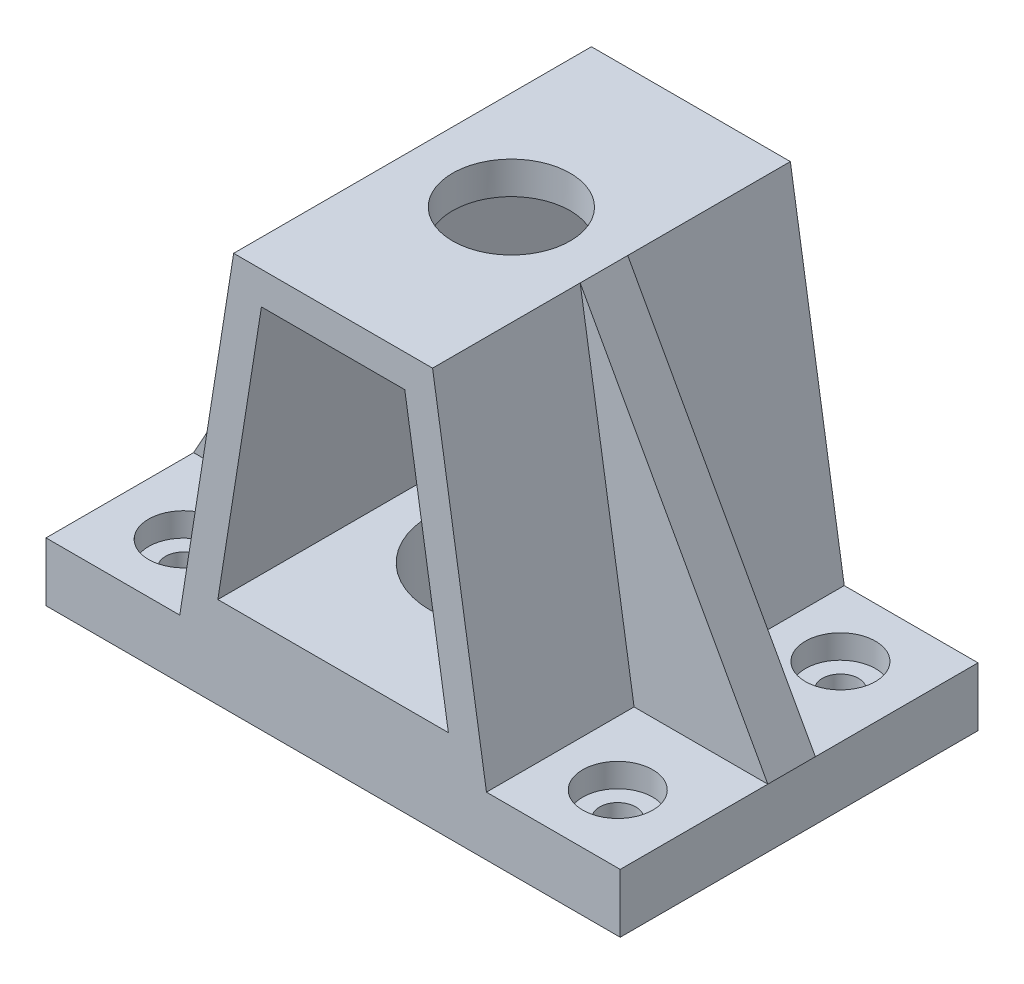
ISO-10303-21;
HEADER;
FILE_DESCRIPTION(('STEP AP214'),'2;1');
FILE_NAME('part.step','',(''),(''),'','','');
FILE_SCHEMA(('AUTOMOTIVE_DESIGN { 1 0 10303 214 1 1 1 1 }'));
ENDSEC;
DATA;
#1=APPLICATION_CONTEXT('core data for automotive mechanical design processes');
#2=APPLICATION_PROTOCOL_DEFINITION('international standard','automotive_design',2000,#1);
#3=PRODUCT_CONTEXT('',#1,'mechanical');
#4=PRODUCT('Part','Part','',(#3));
#5=PRODUCT_RELATED_PRODUCT_CATEGORY('part','',(#4));
#6=PRODUCT_DEFINITION_FORMATION('','',#4);
#7=PRODUCT_DEFINITION_CONTEXT('part definition',#1,'design');
#8=PRODUCT_DEFINITION('design','',#6,#7);
#9=PRODUCT_DEFINITION_SHAPE('','',#8);
#10=(LENGTH_UNIT() NAMED_UNIT(*) SI_UNIT(.MILLI.,.METRE.));
#11=(NAMED_UNIT(*) PLANE_ANGLE_UNIT() SI_UNIT($,.RADIAN.));
#12=(NAMED_UNIT(*) SI_UNIT($,.STERADIAN.) SOLID_ANGLE_UNIT());
#13=UNCERTAINTY_MEASURE_WITH_UNIT(LENGTH_MEASURE(1.E-05),#10,'distance_accuracy_value','');
#14=(GEOMETRIC_REPRESENTATION_CONTEXT(3) GLOBAL_UNCERTAINTY_ASSIGNED_CONTEXT((#13)) GLOBAL_UNIT_ASSIGNED_CONTEXT((#10,
#11,#12)) REPRESENTATION_CONTEXT('',''));
#15=CARTESIAN_POINT('',(0.,0.,0.));
#16=DIRECTION('',(0.,0.,1.));
#17=DIRECTION('',(1.,0.,0.));
#18=AXIS2_PLACEMENT_3D('',#15,#16,#17);
#19=CARTESIAN_POINT('',(0.,5.969,0.));
#20=DIRECTION('',(0.,-1.,0.));
#21=DIRECTION('',(0.,0.,-1.));
#22=AXIS2_PLACEMENT_3D('',#19,#20,#21);
#23=PLANE('',#22);
#24=CARTESIAN_POINT('',(-44.069,5.969,-22.6135882996382));
#25=DIRECTION('',(0.,1.,0.));
#26=DIRECTION('',(0.,0.,1.));
#27=AXIS2_PLACEMENT_3D('',#24,#25,#26);
#28=CIRCLE('',#27,7.112);
#29=CARTESIAN_POINT('',(-44.069,5.969,-15.5015882996382));
#30=VERTEX_POINT('',#29);
#31=EDGE_CURVE('E463',#30,#30,#28,.T.);
#32=ORIENTED_EDGE('',*,*,#31,.F.);
#33=EDGE_LOOP('',(#32));
#34=FACE_BOUND('',#33,.T.);
#35=DIRECTION('',(1.,0.,0.));
#36=VECTOR('',#35,1.);
#37=CARTESIAN_POINT('',(-58.293,5.969,-3.30199999999999));
#38=LINE('',#37,#36);
#39=CARTESIAN_POINT('',(-58.293,5.969,-3.30199999999999));
#40=VERTEX_POINT('',#39);
#41=CARTESIAN_POINT('',(-31.1354642131418,5.969,-3.30199999999999));
#42=VERTEX_POINT('',#41);
#43=EDGE_CURVE('E180',#40,#42,#38,.T.);
#44=ORIENTED_EDGE('',*,*,#43,.T.);
#45=DIRECTION('',(0.,0.,-1.));
#46=VECTOR('',#45,1.);
#47=CARTESIAN_POINT('',(-31.1354642131418,5.969,36.322));
#48=LINE('',#47,#46);
#49=CARTESIAN_POINT('',(-31.1354642131418,5.969,-36.322));
#50=VERTEX_POINT('',#49);
#51=EDGE_CURVE('E165',#42,#50,#48,.T.);
#52=ORIENTED_EDGE('',*,*,#51,.T.);
#53=DIRECTION('',(-1.,0.,0.));
#54=VECTOR('',#53,1.);
#55=CARTESIAN_POINT('',(-58.293,5.969,-36.322));
#56=LINE('',#55,#54);
#57=CARTESIAN_POINT('',(-58.293,5.969,-36.322));
#58=VERTEX_POINT('',#57);
#59=EDGE_CURVE('E320',#50,#58,#56,.T.);
#60=ORIENTED_EDGE('',*,*,#59,.T.);
#61=DIRECTION('',(0.,0.,1.));
#62=VECTOR('',#61,1.);
#63=CARTESIAN_POINT('',(-58.293,5.969,36.322));
#64=LINE('',#63,#62);
#65=EDGE_CURVE('E181',#58,#40,#64,.T.);
#66=ORIENTED_EDGE('',*,*,#65,.T.);
#67=EDGE_LOOP('',(#44,#52,#60,#66));
#68=FACE_BOUND('',#67,.T.);
#69=ADVANCED_FACE('F38',(#34,#68),#23,.F.);
#70=CARTESIAN_POINT('',(-31.1354642131418,5.969,36.322));
#71=DIRECTION('',(0.987688340595137,-0.156434465040234,0.));
#72=DIRECTION('',(0.156434465040234,0.987688340595137,0.));
#73=AXIS2_PLACEMENT_3D('',#70,#71,#72);
#74=PLANE('',#73);
#75=DIRECTION('',(0.156434465040235,0.987688340595137,0.));
#76=VECTOR('',#75,1.);
#77=CARTESIAN_POINT('',(-31.1354642131418,5.969,-3.30199999999999));
#78=LINE('',#77,#76);
#79=CARTESIAN_POINT('',(-20.193,75.057,-3.30199999999999));
#80=VERTEX_POINT('',#79);
#81=EDGE_CURVE('E169',#42,#80,#78,.T.);
#82=ORIENTED_EDGE('',*,*,#81,.T.);
#83=DIRECTION('',(0.,0.,-1.));
#84=VECTOR('',#83,1.);
#85=CARTESIAN_POINT('',(-20.193,75.057,36.322));
#86=LINE('',#85,#84);
#87=CARTESIAN_POINT('',(-20.193,75.057,-36.322));
#88=VERTEX_POINT('',#87);
#89=EDGE_CURVE('E300',#80,#88,#86,.T.);
#90=ORIENTED_EDGE('',*,*,#89,.T.);
#91=DIRECTION('',(-0.156434465040234,-0.987688340595137,0.));
#92=VECTOR('',#91,1.);
#93=CARTESIAN_POINT('',(-31.1354642131418,5.969,-36.322));
#94=LINE('',#93,#92);
#95=EDGE_CURVE('E172',#88,#50,#94,.T.);
#96=ORIENTED_EDGE('',*,*,#95,.T.);
#97=ORIENTED_EDGE('',*,*,#51,.F.);
#98=EDGE_LOOP('',(#82,#90,#96,#97));
#99=FACE_BOUND('',#98,.T.);
#100=ADVANCED_FACE('F167',(#99),#74,.F.);
#101=CARTESIAN_POINT('',(44.069,5.969,-22.6135882996382));
#102=DIRECTION('',(0.,1.,0.));
#103=DIRECTION('',(0.,0.,1.));
#104=AXIS2_PLACEMENT_3D('',#101,#102,#103);
#105=CIRCLE('',#104,7.112);
#106=CARTESIAN_POINT('',(44.069,5.969,-15.5015882996382));
#107=VERTEX_POINT('',#106);
#108=EDGE_CURVE('E479',#107,#107,#105,.T.);
#109=ORIENTED_EDGE('',*,*,#108,.F.);
#110=EDGE_LOOP('',(#109));
#111=FACE_BOUND('',#110,.T.);
#112=DIRECTION('',(-1.,0.,0.));
#113=VECTOR('',#112,1.);
#114=CARTESIAN_POINT('',(58.293,5.969,-3.30199999999999));
#115=LINE('',#114,#113);
#116=CARTESIAN_POINT('',(58.293,5.969,-3.30199999999999));
#117=VERTEX_POINT('',#116);
#118=CARTESIAN_POINT('',(31.1354642131418,5.969,-3.30199999999999));
#119=VERTEX_POINT('',#118);
#120=EDGE_CURVE('E216',#117,#119,#115,.T.);
#121=ORIENTED_EDGE('',*,*,#120,.F.);
#122=DIRECTION('',(0.,0.,-1.));
#123=VECTOR('',#122,1.);
#124=CARTESIAN_POINT('',(58.293,5.969,36.322));
#125=LINE('',#124,#123);
#126=CARTESIAN_POINT('',(58.293,5.969,-36.322));
#127=VERTEX_POINT('',#126);
#128=EDGE_CURVE('E321',#117,#127,#125,.T.);
#129=ORIENTED_EDGE('',*,*,#128,.T.);
#130=CARTESIAN_POINT('',(31.1354642131418,5.969,-36.322));
#131=VERTEX_POINT('',#130);
#132=EDGE_CURVE('E322',#127,#131,#56,.T.);
#133=ORIENTED_EDGE('',*,*,#132,.T.);
#134=DIRECTION('',(0.,0.,-1.));
#135=VECTOR('',#134,1.);
#136=CARTESIAN_POINT('',(31.1354642131418,5.969,36.322));
#137=LINE('',#136,#135);
#138=EDGE_CURVE('E310',#119,#131,#137,.T.);
#139=ORIENTED_EDGE('',*,*,#138,.F.);
#140=EDGE_LOOP('',(#121,#129,#133,#139));
#141=FACE_BOUND('',#140,.T.);
#142=ADVANCED_FACE('F566',(#111,#141),#23,.F.);
#143=CARTESIAN_POINT('',(20.193,75.057,36.322));
#144=DIRECTION('',(-0.987688340595137,-0.156434465040235,0.));
#145=DIRECTION('',(0.156434465040235,-0.987688340595137,0.));
#146=AXIS2_PLACEMENT_3D('',#143,#144,#145);
#147=PLANE('',#146);
#148=DIRECTION('',(-0.156434465040235,0.987688340595137,0.));
#149=VECTOR('',#148,1.);
#150=CARTESIAN_POINT('',(31.1354642131418,5.969,-3.30199999999999));
#151=LINE('',#150,#149);
#152=CARTESIAN_POINT('',(20.193,75.057,-3.30199999999999));
#153=VERTEX_POINT('',#152);
#154=EDGE_CURVE('E208',#119,#153,#151,.T.);
#155=ORIENTED_EDGE('',*,*,#154,.F.);
#156=ORIENTED_EDGE('',*,*,#138,.T.);
#157=DIRECTION('',(-0.156434465040235,0.987688340595137,0.));
#158=VECTOR('',#157,1.);
#159=CARTESIAN_POINT('',(20.193,75.057,-36.322));
#160=LINE('',#159,#158);
#161=CARTESIAN_POINT('',(20.193,75.057,-36.322));
#162=VERTEX_POINT('',#161);
#163=EDGE_CURVE('E281',#131,#162,#160,.T.);
#164=ORIENTED_EDGE('',*,*,#163,.T.);
#165=DIRECTION('',(0.,0.,-1.));
#166=VECTOR('',#165,1.);
#167=CARTESIAN_POINT('',(20.193,75.057,36.322));
#168=LINE('',#167,#166);
#169=EDGE_CURVE('E305',#153,#162,#168,.T.);
#170=ORIENTED_EDGE('',*,*,#169,.F.);
#171=EDGE_LOOP('',(#155,#156,#164,#170));
#172=FACE_BOUND('',#171,.T.);
#173=ADVANCED_FACE('F576',(#172),#147,.F.);
#174=CARTESIAN_POINT('',(44.069,5.969,22.5984117003618));
#175=DIRECTION('',(0.,1.,0.));
#176=DIRECTION('',(0.,0.,1.));
#177=AXIS2_PLACEMENT_3D('',#174,#175,#176);
#178=CIRCLE('',#177,7.112);
#179=CARTESIAN_POINT('',(44.069,5.969,29.7104117003618));
#180=VERTEX_POINT('',#179);
#181=EDGE_CURVE('E495',#180,#180,#178,.T.);
#182=ORIENTED_EDGE('',*,*,#181,.F.);
#183=EDGE_LOOP('',(#182));
#184=FACE_BOUND('',#183,.T.);
#185=CARTESIAN_POINT('',(58.293,5.969,36.322));
#186=VERTEX_POINT('',#185);
#187=CARTESIAN_POINT('',(58.293,5.969,6.35000000000001));
#188=VERTEX_POINT('',#187);
#189=EDGE_CURVE('E316',#186,#188,#125,.T.);
#190=ORIENTED_EDGE('',*,*,#189,.T.);
#191=DIRECTION('',(-1.,0.,0.));
#192=VECTOR('',#191,1.);
#193=CARTESIAN_POINT('',(58.293,5.969,6.35000000000001));
#194=LINE('',#193,#192);
#195=CARTESIAN_POINT('',(31.1354642131418,5.969,6.35000000000001));
#196=VERTEX_POINT('',#195);
#197=EDGE_CURVE('E219',#188,#196,#194,.T.);
#198=ORIENTED_EDGE('',*,*,#197,.T.);
#199=CARTESIAN_POINT('',(31.1354642131418,5.969,36.322));
#200=VERTEX_POINT('',#199);
#201=EDGE_CURVE('E311',#200,#196,#137,.T.);
#202=ORIENTED_EDGE('',*,*,#201,.F.);
#203=DIRECTION('',(1.,0.,0.));
#204=VECTOR('',#203,1.);
#205=CARTESIAN_POINT('',(-58.293,5.969,36.322));
#206=LINE('',#205,#204);
#207=EDGE_CURVE('E329',#200,#186,#206,.T.);
#208=ORIENTED_EDGE('',*,*,#207,.T.);
#209=EDGE_LOOP('',(#190,#198,#202,#208));
#210=FACE_BOUND('',#209,.T.);
#211=ADVANCED_FACE('F377',(#184,#210),#23,.F.);
#212=CARTESIAN_POINT('',(58.293,5.969,36.322));
#213=DIRECTION('',(-1.,0.,0.));
#214=DIRECTION('',(0.,0.,1.));
#215=AXIS2_PLACEMENT_3D('',#212,#213,#214);
#216=PLANE('',#215);
#217=DIRECTION('',(0.,0.,-1.));
#218=VECTOR('',#217,1.);
#219=CARTESIAN_POINT('',(58.293,-5.969,36.322));
#220=LINE('',#219,#218);
#221=CARTESIAN_POINT('',(58.293,-5.969,36.322));
#222=VERTEX_POINT('',#221);
#223=CARTESIAN_POINT('',(58.293,-5.969,-36.322));
#224=VERTEX_POINT('',#223);
#225=EDGE_CURVE('E315',#222,#224,#220,.T.);
#226=ORIENTED_EDGE('',*,*,#225,.T.);
#227=DIRECTION('',(0.,-1.,0.));
#228=VECTOR('',#227,1.);
#229=CARTESIAN_POINT('',(58.293,5.969,-36.322));
#230=LINE('',#229,#228);
#231=EDGE_CURVE('E11',#127,#224,#230,.T.);
#232=ORIENTED_EDGE('',*,*,#231,.F.);
#233=ORIENTED_EDGE('',*,*,#128,.F.);
#234=DIRECTION('',(0.,0.,-1.));
#235=VECTOR('',#234,1.);
#236=CARTESIAN_POINT('',(58.293,5.969,6.35000000000001));
#237=LINE('',#236,#235);
#238=EDGE_CURVE('E232',#188,#117,#237,.T.);
#239=ORIENTED_EDGE('',*,*,#238,.F.);
#240=ORIENTED_EDGE('',*,*,#189,.F.);
#241=DIRECTION('',(0.,-1.,0.));
#242=VECTOR('',#241,1.);
#243=CARTESIAN_POINT('',(58.293,5.969,36.322));
#244=LINE('',#243,#242);
#245=EDGE_CURVE('E334',#186,#222,#244,.T.);
#246=ORIENTED_EDGE('',*,*,#245,.T.);
#247=EDGE_LOOP('',(#226,#232,#233,#239,#240,#246));
#248=FACE_BOUND('',#247,.T.);
#249=ADVANCED_FACE('F40',(#248),#216,.F.);
#250=CARTESIAN_POINT('',(-58.293,5.969,-36.322));
#251=DIRECTION('',(0.,0.,1.));
#252=DIRECTION('',(1.,0.,0.));
#253=AXIS2_PLACEMENT_3D('',#250,#251,#252);
#254=PLANE('',#253);
#255=DIRECTION('',(-1.,0.,0.));
#256=VECTOR('',#255,1.);
#257=CARTESIAN_POINT('',(-58.293,-5.969,-36.322));
#258=LINE('',#257,#256);
#259=CARTESIAN_POINT('',(-58.293,-5.969,-36.322));
#260=VERTEX_POINT('',#259);
#261=EDGE_CURVE('E338',#224,#260,#258,.T.);
#262=ORIENTED_EDGE('',*,*,#261,.T.);
#263=DIRECTION('',(0.,-1.,0.));
#264=VECTOR('',#263,1.);
#265=CARTESIAN_POINT('',(-58.293,5.969,-36.322));
#266=LINE('',#265,#264);
#267=EDGE_CURVE('E47',#58,#260,#266,.T.);
#268=ORIENTED_EDGE('',*,*,#267,.F.);
#269=ORIENTED_EDGE('',*,*,#59,.F.);
#270=ORIENTED_EDGE('',*,*,#95,.F.);
#271=DIRECTION('',(-1.,0.,0.));
#272=VECTOR('',#271,1.);
#273=CARTESIAN_POINT('',(-20.193,75.057,-36.322));
#274=LINE('',#273,#272);
#275=EDGE_CURVE('E293',#162,#88,#274,.T.);
#276=ORIENTED_EDGE('',*,*,#275,.F.);
#277=ORIENTED_EDGE('',*,*,#163,.F.);
#278=ORIENTED_EDGE('',*,*,#132,.F.);
#279=ORIENTED_EDGE('',*,*,#231,.T.);
#280=EDGE_LOOP('',(#262,#268,#269,#270,#276,#277,#278,#279));
#281=FACE_BOUND('',#280,.T.);
#282=DIRECTION('',(-0.156434465040234,-0.987688340595137,0.));
#283=VECTOR('',#282,1.);
#284=CARTESIAN_POINT('',(-23.4031736785346,12.573,-36.322));
#285=LINE('',#284,#283);
#286=CARTESIAN_POINT('',(-14.5526511531993,68.453,-36.322));
#287=VERTEX_POINT('',#286);
#288=CARTESIAN_POINT('',(-23.4031736785346,12.573,-36.322));
#289=VERTEX_POINT('',#288);
#290=EDGE_CURVE('E243',#287,#289,#285,.T.);
#291=ORIENTED_EDGE('',*,*,#290,.T.);
#292=DIRECTION('',(1.,0.,0.));
#293=VECTOR('',#292,1.);
#294=CARTESIAN_POINT('',(23.4031736785346,12.573,-36.322));
#295=LINE('',#294,#293);
#296=CARTESIAN_POINT('',(23.4031736785346,12.573,-36.322));
#297=VERTEX_POINT('',#296);
#298=EDGE_CURVE('E235',#289,#297,#295,.T.);
#299=ORIENTED_EDGE('',*,*,#298,.T.);
#300=DIRECTION('',(-0.156434465040235,0.987688340595137,0.));
#301=VECTOR('',#300,1.);
#302=CARTESIAN_POINT('',(14.5526511531993,68.453,-36.322));
#303=LINE('',#302,#301);
#304=CARTESIAN_POINT('',(14.5526511531993,68.453,-36.322));
#305=VERTEX_POINT('',#304);
#306=EDGE_CURVE('E257',#297,#305,#303,.T.);
#307=ORIENTED_EDGE('',*,*,#306,.T.);
#308=DIRECTION('',(-1.,0.,0.));
#309=VECTOR('',#308,1.);
#310=CARTESIAN_POINT('',(-14.5526511531993,68.453,-36.322));
#311=LINE('',#310,#309);
#312=EDGE_CURVE('E261',#305,#287,#311,.T.);
#313=ORIENTED_EDGE('',*,*,#312,.T.);
#314=EDGE_LOOP('',(#291,#299,#307,#313));
#315=FACE_BOUND('',#314,.T.);
#316=ADVANCED_FACE('F548',(#281,#315),#254,.F.);
#317=CARTESIAN_POINT('',(-58.293,5.969,36.322));
#318=DIRECTION('',(1.,0.,0.));
#319=DIRECTION('',(0.,0.,-1.));
#320=AXIS2_PLACEMENT_3D('',#317,#318,#319);
#321=PLANE('',#320);
#322=DIRECTION('',(0.,0.,1.));
#323=VECTOR('',#322,1.);
#324=CARTESIAN_POINT('',(-58.293,-5.969,36.322));
#325=LINE('',#324,#323);
#326=CARTESIAN_POINT('',(-58.293,-5.969,36.322));
#327=VERTEX_POINT('',#326);
#328=EDGE_CURVE('E341',#260,#327,#325,.T.);
#329=ORIENTED_EDGE('',*,*,#328,.T.);
#330=DIRECTION('',(0.,-1.,0.));
#331=VECTOR('',#330,1.);
#332=CARTESIAN_POINT('',(-58.293,5.969,36.322));
#333=LINE('',#332,#331);
#334=CARTESIAN_POINT('',(-58.293,5.969,36.322));
#335=VERTEX_POINT('',#334);
#336=EDGE_CURVE('E350',#335,#327,#333,.T.);
#337=ORIENTED_EDGE('',*,*,#336,.F.);
#338=CARTESIAN_POINT('',(-58.293,5.969,6.35000000000001));
#339=VERTEX_POINT('',#338);
#340=EDGE_CURVE('E326',#339,#335,#64,.T.);
#341=ORIENTED_EDGE('',*,*,#340,.F.);
#342=DIRECTION('',(0.,0.,-1.));
#343=VECTOR('',#342,1.);
#344=CARTESIAN_POINT('',(-58.293,5.969,6.35000000000001));
#345=LINE('',#344,#343);
#346=EDGE_CURVE('E61',#339,#40,#345,.T.);
#347=ORIENTED_EDGE('',*,*,#346,.T.);
#348=ORIENTED_EDGE('',*,*,#65,.F.);
#349=ORIENTED_EDGE('',*,*,#267,.T.);
#350=EDGE_LOOP('',(#329,#337,#341,#347,#348,#349));
#351=FACE_BOUND('',#350,.T.);
#352=ADVANCED_FACE('F358',(#351),#321,.F.);
#353=CARTESIAN_POINT('',(-58.293,5.969,36.322));
#354=DIRECTION('',(0.,0.,-1.));
#355=DIRECTION('',(-1.,0.,0.));
#356=AXIS2_PLACEMENT_3D('',#353,#354,#355);
#357=PLANE('',#356);
#358=DIRECTION('',(1.,0.,0.));
#359=VECTOR('',#358,1.);
#360=CARTESIAN_POINT('',(-58.293,-5.969,36.322));
#361=LINE('',#360,#359);
#362=EDGE_CURVE('E344',#327,#222,#361,.T.);
#363=ORIENTED_EDGE('',*,*,#362,.T.);
#364=ORIENTED_EDGE('',*,*,#245,.F.);
#365=ORIENTED_EDGE('',*,*,#207,.F.);
#366=DIRECTION('',(-0.156434465040235,0.987688340595137,0.));
#367=VECTOR('',#366,1.);
#368=CARTESIAN_POINT('',(20.193,75.057,36.322));
#369=LINE('',#368,#367);
#370=CARTESIAN_POINT('',(20.193,75.057,36.322));
#371=VERTEX_POINT('',#370);
#372=EDGE_CURVE('E282',#200,#371,#369,.T.);
#373=ORIENTED_EDGE('',*,*,#372,.T.);
#374=DIRECTION('',(-1.,0.,0.));
#375=VECTOR('',#374,1.);
#376=CARTESIAN_POINT('',(-20.193,75.057,36.322));
#377=LINE('',#376,#375);
#378=CARTESIAN_POINT('',(-20.193,75.057,36.322));
#379=VERTEX_POINT('',#378);
#380=EDGE_CURVE('E285',#371,#379,#377,.T.);
#381=ORIENTED_EDGE('',*,*,#380,.T.);
#382=DIRECTION('',(-0.156434465040234,-0.987688340595137,0.));
#383=VECTOR('',#382,1.);
#384=CARTESIAN_POINT('',(-31.1354642131418,5.969,36.322));
#385=LINE('',#384,#383);
#386=CARTESIAN_POINT('',(-31.1354642131418,5.969,36.322));
#387=VERTEX_POINT('',#386);
#388=EDGE_CURVE('E177',#379,#387,#385,.T.);
#389=ORIENTED_EDGE('',*,*,#388,.T.);
#390=EDGE_CURVE('E330',#335,#387,#206,.T.);
#391=ORIENTED_EDGE('',*,*,#390,.F.);
#392=ORIENTED_EDGE('',*,*,#336,.T.);
#393=EDGE_LOOP('',(#363,#364,#365,#373,#381,#389,#391,#392));
#394=FACE_BOUND('',#393,.T.);
#395=DIRECTION('',(1.,0.,0.));
#396=VECTOR('',#395,1.);
#397=CARTESIAN_POINT('',(23.4031736785346,12.573,36.322));
#398=LINE('',#397,#396);
#399=CARTESIAN_POINT('',(-23.4031736785346,12.573,36.322));
#400=VERTEX_POINT('',#399);
#401=CARTESIAN_POINT('',(23.4031736785346,12.573,36.322));
#402=VERTEX_POINT('',#401);
#403=EDGE_CURVE('E239',#400,#402,#398,.T.);
#404=ORIENTED_EDGE('',*,*,#403,.F.);
#405=DIRECTION('',(-0.156434465040234,-0.987688340595137,0.));
#406=VECTOR('',#405,1.);
#407=CARTESIAN_POINT('',(-23.4031736785346,12.573,36.322));
#408=LINE('',#407,#406);
#409=CARTESIAN_POINT('',(-14.5526511531993,68.453,36.322));
#410=VERTEX_POINT('',#409);
#411=EDGE_CURVE('E250',#410,#400,#408,.T.);
#412=ORIENTED_EDGE('',*,*,#411,.F.);
#413=DIRECTION('',(-1.,0.,0.));
#414=VECTOR('',#413,1.);
#415=CARTESIAN_POINT('',(-14.5526511531993,68.453,36.322));
#416=LINE('',#415,#414);
#417=CARTESIAN_POINT('',(14.5526511531993,68.453,36.322));
#418=VERTEX_POINT('',#417);
#419=EDGE_CURVE('E246',#418,#410,#416,.T.);
#420=ORIENTED_EDGE('',*,*,#419,.F.);
#421=DIRECTION('',(-0.156434465040235,0.987688340595137,0.));
#422=VECTOR('',#421,1.);
#423=CARTESIAN_POINT('',(14.5526511531993,68.453,36.322));
#424=LINE('',#423,#422);
#425=EDGE_CURVE('E242',#402,#418,#424,.T.);
#426=ORIENTED_EDGE('',*,*,#425,.F.);
#427=EDGE_LOOP('',(#404,#412,#420,#426));
#428=FACE_BOUND('',#427,.T.);
#429=ADVANCED_FACE('F367',(#394,#428),#357,.F.);
#430=CARTESIAN_POINT('',(-44.069,5.969,22.5984117003618));
#431=DIRECTION('',(0.,1.,0.));
#432=DIRECTION('',(0.,0.,1.));
#433=AXIS2_PLACEMENT_3D('',#430,#431,#432);
#434=CIRCLE('',#433,7.112);
#435=CARTESIAN_POINT('',(-44.069,5.969,29.7104117003618));
#436=VERTEX_POINT('',#435);
#437=EDGE_CURVE('E511',#436,#436,#434,.T.);
#438=ORIENTED_EDGE('',*,*,#437,.F.);
#439=EDGE_LOOP('',(#438));
#440=FACE_BOUND('',#439,.T.);
#441=CARTESIAN_POINT('',(-31.1354642131418,5.969,6.35000000000001));
#442=VERTEX_POINT('',#441);
#443=EDGE_CURVE('E176',#387,#442,#48,.T.);
#444=ORIENTED_EDGE('',*,*,#443,.T.);
#445=DIRECTION('',(1.,0.,0.));
#446=VECTOR('',#445,1.);
#447=CARTESIAN_POINT('',(-58.293,5.969,6.35000000000001));
#448=LINE('',#447,#446);
#449=EDGE_CURVE('E54',#339,#442,#448,.T.);
#450=ORIENTED_EDGE('',*,*,#449,.F.);
#451=ORIENTED_EDGE('',*,*,#340,.T.);
#452=ORIENTED_EDGE('',*,*,#390,.T.);
#453=EDGE_LOOP('',(#444,#450,#451,#452));
#454=FACE_BOUND('',#453,.T.);
#455=ADVANCED_FACE('F567',(#440,#454),#23,.F.);
#456=CARTESIAN_POINT('',(0.,-5.969,0.));
#457=DIRECTION('',(0.,-1.,0.));
#458=DIRECTION('',(0.,0.,-1.));
#459=AXIS2_PLACEMENT_3D('',#456,#457,#458);
#460=PLANE('',#459);
#461=CARTESIAN_POINT('',(0.,-5.969,0.));
#462=DIRECTION('',(0.,1.,0.));
#463=DIRECTION('',(0.,0.,1.));
#464=AXIS2_PLACEMENT_3D('',#461,#462,#463);
#465=CIRCLE('',#464,16.637);
#466=CARTESIAN_POINT('',(0.,-5.969,16.637));
#467=VERTEX_POINT('',#466);
#468=EDGE_CURVE('E515',#467,#467,#465,.T.);
#469=ORIENTED_EDGE('',*,*,#468,.T.);
#470=EDGE_LOOP('',(#469));
#471=FACE_BOUND('',#470,.T.);
#472=CARTESIAN_POINT('',(-44.069,-5.969,22.5984117003618));
#473=DIRECTION('',(0.,1.,0.));
#474=DIRECTION('',(0.,0.,1.));
#475=AXIS2_PLACEMENT_3D('',#472,#473,#474);
#476=CIRCLE('',#475,3.683);
#477=CARTESIAN_POINT('',(-44.069,-5.969,26.2814117003618));
#478=VERTEX_POINT('',#477);
#479=EDGE_CURVE('E499',#478,#478,#476,.T.);
#480=ORIENTED_EDGE('',*,*,#479,.T.);
#481=EDGE_LOOP('',(#480));
#482=FACE_BOUND('',#481,.T.);
#483=CARTESIAN_POINT('',(44.069,-5.969,22.5984117003618));
#484=DIRECTION('',(0.,1.,0.));
#485=DIRECTION('',(0.,0.,1.));
#486=AXIS2_PLACEMENT_3D('',#483,#484,#485);
#487=CIRCLE('',#486,3.683);
#488=CARTESIAN_POINT('',(44.069,-5.969,26.2814117003618));
#489=VERTEX_POINT('',#488);
#490=EDGE_CURVE('E483',#489,#489,#487,.T.);
#491=ORIENTED_EDGE('',*,*,#490,.T.);
#492=EDGE_LOOP('',(#491));
#493=FACE_BOUND('',#492,.T.);
#494=CARTESIAN_POINT('',(44.069,-5.969,-22.6135882996382));
#495=DIRECTION('',(0.,1.,0.));
#496=DIRECTION('',(0.,0.,1.));
#497=AXIS2_PLACEMENT_3D('',#494,#495,#496);
#498=CIRCLE('',#497,3.683);
#499=CARTESIAN_POINT('',(44.069,-5.969,-18.9305882996382));
#500=VERTEX_POINT('',#499);
#501=EDGE_CURVE('E467',#500,#500,#498,.T.);
#502=ORIENTED_EDGE('',*,*,#501,.T.);
#503=EDGE_LOOP('',(#502));
#504=FACE_BOUND('',#503,.T.);
#505=CARTESIAN_POINT('',(-44.069,-5.969,-22.6135882996382));
#506=DIRECTION('',(0.,1.,0.));
#507=DIRECTION('',(0.,0.,1.));
#508=AXIS2_PLACEMENT_3D('',#505,#506,#507);
#509=CIRCLE('',#508,3.683);
#510=CARTESIAN_POINT('',(-44.069,-5.969,-18.9305882996382));
#511=VERTEX_POINT('',#510);
#512=EDGE_CURVE('E450',#511,#511,#509,.T.);
#513=ORIENTED_EDGE('',*,*,#512,.T.);
#514=EDGE_LOOP('',(#513));
#515=FACE_BOUND('',#514,.T.);
#516=ORIENTED_EDGE('',*,*,#225,.F.);
#517=ORIENTED_EDGE('',*,*,#362,.F.);
#518=ORIENTED_EDGE('',*,*,#328,.F.);
#519=ORIENTED_EDGE('',*,*,#261,.F.);
#520=EDGE_LOOP('',(#516,#517,#518,#519));
#521=FACE_BOUND('',#520,.T.);
#522=ADVANCED_FACE('F364',(#471,#482,#493,#504,#515,#521),#460,.T.);
#523=ORIENTED_EDGE('',*,*,#201,.T.);
#524=DIRECTION('',(-0.156434465040235,0.987688340595137,0.));
#525=VECTOR('',#524,1.);
#526=CARTESIAN_POINT('',(31.1354642131418,5.969,6.35000000000001));
#527=LINE('',#526,#525);
#528=CARTESIAN_POINT('',(20.193,75.057,6.35000000000001));
#529=VERTEX_POINT('',#528);
#530=EDGE_CURVE('E211',#196,#529,#527,.T.);
#531=ORIENTED_EDGE('',*,*,#530,.T.);
#532=EDGE_CURVE('E306',#371,#529,#168,.T.);
#533=ORIENTED_EDGE('',*,*,#532,.F.);
#534=ORIENTED_EDGE('',*,*,#372,.F.);
#535=EDGE_LOOP('',(#523,#531,#533,#534));
#536=FACE_BOUND('',#535,.T.);
#537=ADVANCED_FACE('F584',(#536),#147,.F.);
#538=CARTESIAN_POINT('',(-20.193,75.057,36.322));
#539=DIRECTION('',(0.,-1.,0.));
#540=DIRECTION('',(0.,0.,-1.));
#541=AXIS2_PLACEMENT_3D('',#538,#539,#540);
#542=PLANE('',#541);
#543=CARTESIAN_POINT('',(-0.126999999999995,75.057,0.));
#544=DIRECTION('',(0.,1.,0.));
#545=DIRECTION('',(0.,0.,1.));
#546=AXIS2_PLACEMENT_3D('',#543,#544,#545);
#547=CIRCLE('',#546,11.938);
#548=CARTESIAN_POINT('',(-0.126999999999995,75.057,11.938));
#549=VERTEX_POINT('',#548);
#550=EDGE_CURVE('E191',#549,#549,#547,.T.);
#551=ORIENTED_EDGE('',*,*,#550,.F.);
#552=EDGE_LOOP('',(#551));
#553=FACE_BOUND('',#552,.T.);
#554=ORIENTED_EDGE('',*,*,#275,.T.);
#555=ORIENTED_EDGE('',*,*,#89,.F.);
#556=DIRECTION('',(0.,0.,-1.));
#557=VECTOR('',#556,1.);
#558=CARTESIAN_POINT('',(-20.193,75.057,6.35000000000001));
#559=LINE('',#558,#557);
#560=CARTESIAN_POINT('',(-20.193,75.057,6.35000000000001));
#561=VERTEX_POINT('',#560);
#562=EDGE_CURVE('E205',#561,#80,#559,.T.);
#563=ORIENTED_EDGE('',*,*,#562,.F.);
#564=EDGE_CURVE('E301',#379,#561,#86,.T.);
#565=ORIENTED_EDGE('',*,*,#564,.F.);
#566=ORIENTED_EDGE('',*,*,#380,.F.);
#567=ORIENTED_EDGE('',*,*,#532,.T.);
#568=DIRECTION('',(0.,0.,-1.));
#569=VECTOR('',#568,1.);
#570=CARTESIAN_POINT('',(20.193,75.057,6.35000000000001));
#571=LINE('',#570,#569);
#572=EDGE_CURVE('E223',#529,#153,#571,.T.);
#573=ORIENTED_EDGE('',*,*,#572,.T.);
#574=ORIENTED_EDGE('',*,*,#169,.T.);
#575=EDGE_LOOP('',(#554,#555,#563,#565,#566,#567,#573,#574));
#576=FACE_BOUND('',#575,.T.);
#577=ADVANCED_FACE('F799',(#553,#576),#542,.F.);
#578=ORIENTED_EDGE('',*,*,#564,.T.);
#579=DIRECTION('',(0.156434465040235,0.987688340595137,0.));
#580=VECTOR('',#579,1.);
#581=CARTESIAN_POINT('',(-31.1354642131418,5.969,6.35000000000001));
#582=LINE('',#581,#580);
#583=EDGE_CURVE('E204',#442,#561,#582,.T.);
#584=ORIENTED_EDGE('',*,*,#583,.F.);
#585=ORIENTED_EDGE('',*,*,#443,.F.);
#586=ORIENTED_EDGE('',*,*,#388,.F.);
#587=EDGE_LOOP('',(#578,#584,#585,#586));
#588=FACE_BOUND('',#587,.T.);
#589=ADVANCED_FACE('F538',(#588),#74,.F.);
#590=CARTESIAN_POINT('',(23.4031736785346,12.573,36.322));
#591=DIRECTION('',(0.,1.,0.));
#592=DIRECTION('',(0.,0.,1.));
#593=AXIS2_PLACEMENT_3D('',#590,#591,#592);
#594=PLANE('',#593);
#595=CARTESIAN_POINT('',(0.,12.573,0.));
#596=DIRECTION('',(0.,1.,0.));
#597=DIRECTION('',(0.,0.,1.));
#598=AXIS2_PLACEMENT_3D('',#595,#596,#597);
#599=CIRCLE('',#598,16.637);
#600=CARTESIAN_POINT('',(0.,12.573,16.637));
#601=VERTEX_POINT('',#600);
#602=EDGE_CURVE('E516',#601,#601,#599,.T.);
#603=ORIENTED_EDGE('',*,*,#602,.F.);
#604=EDGE_LOOP('',(#603));
#605=FACE_BOUND('',#604,.T.);
#606=ORIENTED_EDGE('',*,*,#298,.F.);
#607=DIRECTION('',(0.,0.,-1.));
#608=VECTOR('',#607,1.);
#609=CARTESIAN_POINT('',(-23.4031736785346,12.573,36.322));
#610=LINE('',#609,#608);
#611=EDGE_CURVE('E253',#400,#289,#610,.T.);
#612=ORIENTED_EDGE('',*,*,#611,.F.);
#613=ORIENTED_EDGE('',*,*,#403,.T.);
#614=DIRECTION('',(0.,0.,-1.));
#615=VECTOR('',#614,1.);
#616=CARTESIAN_POINT('',(23.4031736785346,12.573,36.322));
#617=LINE('',#616,#615);
#618=EDGE_CURVE('E277',#402,#297,#617,.T.);
#619=ORIENTED_EDGE('',*,*,#618,.T.);
#620=EDGE_LOOP('',(#606,#612,#613,#619));
#621=FACE_BOUND('',#620,.T.);
#622=ADVANCED_FACE('F534',(#605,#621),#594,.T.);
#623=CARTESIAN_POINT('',(14.5526511531993,68.453,36.322));
#624=DIRECTION('',(-0.987688340595137,-0.156434465040235,0.));
#625=DIRECTION('',(0.156434465040235,-0.987688340595137,0.));
#626=AXIS2_PLACEMENT_3D('',#623,#624,#625);
#627=PLANE('',#626);
#628=ORIENTED_EDGE('',*,*,#306,.F.);
#629=ORIENTED_EDGE('',*,*,#618,.F.);
#630=ORIENTED_EDGE('',*,*,#425,.T.);
#631=DIRECTION('',(0.,0.,-1.));
#632=VECTOR('',#631,1.);
#633=CARTESIAN_POINT('',(14.5526511531993,68.453,36.322));
#634=LINE('',#633,#632);
#635=EDGE_CURVE('E274',#418,#305,#634,.T.);
#636=ORIENTED_EDGE('',*,*,#635,.T.);
#637=EDGE_LOOP('',(#628,#629,#630,#636));
#638=FACE_BOUND('',#637,.T.);
#639=ADVANCED_FACE('F537',(#638),#627,.T.);
#640=CARTESIAN_POINT('',(-14.5526511531993,68.453,36.322));
#641=DIRECTION('',(0.,-1.,0.));
#642=DIRECTION('',(0.,0.,-1.));
#643=AXIS2_PLACEMENT_3D('',#640,#641,#642);
#644=PLANE('',#643);
#645=CARTESIAN_POINT('',(-0.126999999999995,68.453,0.));
#646=DIRECTION('',(0.,-1.,0.));
#647=DIRECTION('',(0.,0.,-1.));
#648=AXIS2_PLACEMENT_3D('',#645,#646,#647);
#649=CIRCLE('',#648,11.938);
#650=CARTESIAN_POINT('',(-0.126999999999995,68.453,-11.938));
#651=VERTEX_POINT('',#650);
#652=EDGE_CURVE('E196',#651,#651,#649,.F.);
#653=ORIENTED_EDGE('',*,*,#652,.T.);
#654=EDGE_LOOP('',(#653));
#655=FACE_BOUND('',#654,.T.);
#656=ORIENTED_EDGE('',*,*,#312,.F.);
#657=ORIENTED_EDGE('',*,*,#635,.F.);
#658=ORIENTED_EDGE('',*,*,#419,.T.);
#659=DIRECTION('',(0.,0.,-1.));
#660=VECTOR('',#659,1.);
#661=CARTESIAN_POINT('',(-14.5526511531993,68.453,36.322));
#662=LINE('',#661,#660);
#663=EDGE_CURVE('E271',#410,#287,#662,.T.);
#664=ORIENTED_EDGE('',*,*,#663,.T.);
#665=EDGE_LOOP('',(#656,#657,#658,#664));
#666=FACE_BOUND('',#665,.T.);
#667=ADVANCED_FACE('F552',(#655,#666),#644,.T.);
#668=CARTESIAN_POINT('',(-23.4031736785346,12.573,36.322));
#669=DIRECTION('',(0.987688340595137,-0.156434465040234,0.));
#670=DIRECTION('',(0.156434465040234,0.987688340595137,0.));
#671=AXIS2_PLACEMENT_3D('',#668,#669,#670);
#672=PLANE('',#671);
#673=ORIENTED_EDGE('',*,*,#290,.F.);
#674=ORIENTED_EDGE('',*,*,#663,.F.);
#675=ORIENTED_EDGE('',*,*,#411,.T.);
#676=ORIENTED_EDGE('',*,*,#611,.T.);
#677=EDGE_LOOP('',(#673,#674,#675,#676));
#678=FACE_BOUND('',#677,.T.);
#679=ADVANCED_FACE('F546',(#678),#672,.T.);
#680=CARTESIAN_POINT('',(20.193,75.057,6.35000000000001));
#681=DIRECTION('',(0.875671578316664,0.482907120395219,0.));
#682=DIRECTION('',(-0.482907120395219,0.875671578316664,0.));
#683=AXIS2_PLACEMENT_3D('',#680,#681,#682);
#684=PLANE('',#683);
#685=DIRECTION('',(0.482907120395219,-0.875671578316664,0.));
#686=VECTOR('',#685,1.);
#687=CARTESIAN_POINT('',(20.193,75.057,-3.30199999999999));
#688=LINE('',#687,#686);
#689=EDGE_CURVE('E226',#153,#117,#688,.T.);
#690=ORIENTED_EDGE('',*,*,#689,.F.);
#691=ORIENTED_EDGE('',*,*,#572,.F.);
#692=DIRECTION('',(0.482907120395219,-0.875671578316664,0.));
#693=VECTOR('',#692,1.);
#694=CARTESIAN_POINT('',(20.193,75.057,6.35000000000001));
#695=LINE('',#694,#693);
#696=EDGE_CURVE('E215',#529,#188,#695,.T.);
#697=ORIENTED_EDGE('',*,*,#696,.T.);
#698=ORIENTED_EDGE('',*,*,#238,.T.);
#699=EDGE_LOOP('',(#690,#691,#697,#698));
#700=FACE_BOUND('',#699,.T.);
#701=ADVANCED_FACE('F659',(#700),#684,.T.);
#702=CARTESIAN_POINT('',(0.,0.,6.35000000000001));
#703=DIRECTION('',(0.,0.,1.));
#704=DIRECTION('',(1.,0.,0.));
#705=AXIS2_PLACEMENT_3D('',#702,#703,#704);
#706=PLANE('',#705);
#707=ORIENTED_EDGE('',*,*,#530,.F.);
#708=ORIENTED_EDGE('',*,*,#197,.F.);
#709=ORIENTED_EDGE('',*,*,#696,.F.);
#710=EDGE_LOOP('',(#707,#708,#709));
#711=FACE_BOUND('',#710,.T.);
#712=ADVANCED_FACE('F656',(#711),#706,.T.);
#713=CARTESIAN_POINT('',(0.,0.,-3.30199999999999));
#714=DIRECTION('',(0.,0.,1.));
#715=DIRECTION('',(1.,0.,0.));
#716=AXIS2_PLACEMENT_3D('',#713,#714,#715);
#717=PLANE('',#716);
#718=ORIENTED_EDGE('',*,*,#154,.T.);
#719=ORIENTED_EDGE('',*,*,#689,.T.);
#720=ORIENTED_EDGE('',*,*,#120,.T.);
#721=EDGE_LOOP('',(#718,#719,#720));
#722=FACE_BOUND('',#721,.T.);
#723=ADVANCED_FACE('F654',(#722),#717,.F.);
#724=CARTESIAN_POINT('',(-20.193,75.057,6.35000000000001));
#725=DIRECTION('',(0.875671578316664,-0.482907120395219,0.));
#726=DIRECTION('',(0.482907120395219,0.875671578316664,0.));
#727=AXIS2_PLACEMENT_3D('',#724,#725,#726);
#728=PLANE('',#727);
#729=DIRECTION('',(-0.482907120395219,-0.875671578316664,0.));
#730=VECTOR('',#729,1.);
#731=CARTESIAN_POINT('',(-20.193,75.057,-3.30199999999999));
#732=LINE('',#731,#730);
#733=EDGE_CURVE('E186',#80,#40,#732,.T.);
#734=ORIENTED_EDGE('',*,*,#733,.T.);
#735=ORIENTED_EDGE('',*,*,#346,.F.);
#736=DIRECTION('',(-0.482907120395219,-0.875671578316664,0.));
#737=VECTOR('',#736,1.);
#738=CARTESIAN_POINT('',(-20.193,75.057,6.35000000000001));
#739=LINE('',#738,#737);
#740=EDGE_CURVE('E199',#561,#339,#739,.T.);
#741=ORIENTED_EDGE('',*,*,#740,.F.);
#742=ORIENTED_EDGE('',*,*,#562,.T.);
#743=EDGE_LOOP('',(#734,#735,#741,#742));
#744=FACE_BOUND('',#743,.T.);
#745=ADVANCED_FACE('F649',(#744),#728,.F.);
#746=CARTESIAN_POINT('',(0.,0.,6.35000000000001));
#747=DIRECTION('',(0.,0.,1.));
#748=DIRECTION('',(-1.,0.,0.));
#749=AXIS2_PLACEMENT_3D('',#746,#747,#748);
#750=PLANE('',#749);
#751=ORIENTED_EDGE('',*,*,#583,.T.);
#752=ORIENTED_EDGE('',*,*,#740,.T.);
#753=ORIENTED_EDGE('',*,*,#449,.T.);
#754=EDGE_LOOP('',(#751,#752,#753));
#755=FACE_BOUND('',#754,.T.);
#756=ADVANCED_FACE('F646',(#755),#750,.T.);
#757=CARTESIAN_POINT('',(0.,0.,-3.30199999999999));
#758=DIRECTION('',(0.,0.,1.));
#759=DIRECTION('',(-1.,0.,0.));
#760=AXIS2_PLACEMENT_3D('',#757,#758,#759);
#761=PLANE('',#760);
#762=ORIENTED_EDGE('',*,*,#81,.F.);
#763=ORIENTED_EDGE('',*,*,#43,.F.);
#764=ORIENTED_EDGE('',*,*,#733,.F.);
#765=EDGE_LOOP('',(#762,#763,#764));
#766=FACE_BOUND('',#765,.T.);
#767=ADVANCED_FACE('F188',(#766),#761,.F.);
#768=CARTESIAN_POINT('',(-0.126999999999995,-5.97,0.));
#769=DIRECTION('',(0.,1.,0.));
#770=DIRECTION('',(0.,0.,1.));
#771=AXIS2_PLACEMENT_3D('',#768,#769,#770);
#772=CYLINDRICAL_SURFACE('',#771,11.938);
#773=ORIENTED_EDGE('',*,*,#652,.F.);
#774=EDGE_LOOP('',(#773));
#775=FACE_BOUND('',#774,.T.);
#776=ORIENTED_EDGE('',*,*,#550,.T.);
#777=EDGE_LOOP('',(#776));
#778=FACE_BOUND('',#777,.T.);
#779=ADVANCED_FACE('F641',(#775,#778),#772,.F.);
#780=CARTESIAN_POINT('',(-44.069,5.969,-22.6135882996382));
#781=DIRECTION('',(0.,1.,0.));
#782=DIRECTION('',(0.,0.,1.));
#783=AXIS2_PLACEMENT_3D('',#780,#781,#782);
#784=CYLINDRICAL_SURFACE('',#783,3.683);
#785=ORIENTED_EDGE('',*,*,#512,.F.);
#786=EDGE_LOOP('',(#785));
#787=FACE_BOUND('',#786,.T.);
#788=CARTESIAN_POINT('',(-44.069,1.143,-22.6135882996382));
#789=DIRECTION('',(0.,1.,0.));
#790=DIRECTION('',(0.,0.,1.));
#791=AXIS2_PLACEMENT_3D('',#788,#789,#790);
#792=CIRCLE('',#791,3.683);
#793=CARTESIAN_POINT('',(-44.069,1.143,-18.9305882996382));
#794=VERTEX_POINT('',#793);
#795=EDGE_CURVE('E455',#794,#794,#792,.T.);
#796=ORIENTED_EDGE('',*,*,#795,.T.);
#797=EDGE_LOOP('',(#796));
#798=FACE_BOUND('',#797,.T.);
#799=ADVANCED_FACE('F637',(#787,#798),#784,.F.);
#800=CARTESIAN_POINT('',(-40.386,1.143,-22.6135882996382));
#801=DIRECTION('',(0.,-1.,0.));
#802=DIRECTION('',(0.,0.,-1.));
#803=AXIS2_PLACEMENT_3D('',#800,#801,#802);
#804=PLANE('',#803);
#805=ORIENTED_EDGE('',*,*,#795,.F.);
#806=EDGE_LOOP('',(#805));
#807=FACE_BOUND('',#806,.T.);
#808=CARTESIAN_POINT('',(-44.069,1.143,-22.6135882996382));
#809=DIRECTION('',(0.,1.,0.));
#810=DIRECTION('',(0.,0.,1.));
#811=AXIS2_PLACEMENT_3D('',#808,#809,#810);
#812=CIRCLE('',#811,7.112);
#813=CARTESIAN_POINT('',(-44.069,1.143,-15.5015882996382));
#814=VERTEX_POINT('',#813);
#815=EDGE_CURVE('E459',#814,#814,#812,.T.);
#816=ORIENTED_EDGE('',*,*,#815,.T.);
#817=EDGE_LOOP('',(#816));
#818=FACE_BOUND('',#817,.T.);
#819=ADVANCED_FACE('F633',(#807,#818),#804,.F.);
#820=CARTESIAN_POINT('',(-44.069,5.969,-22.6135882996382));
#821=DIRECTION('',(0.,1.,0.));
#822=DIRECTION('',(0.,0.,1.));
#823=AXIS2_PLACEMENT_3D('',#820,#821,#822);
#824=CYLINDRICAL_SURFACE('',#823,7.112);
#825=ORIENTED_EDGE('',*,*,#815,.F.);
#826=EDGE_LOOP('',(#825));
#827=FACE_BOUND('',#826,.T.);
#828=ORIENTED_EDGE('',*,*,#31,.T.);
#829=EDGE_LOOP('',(#828));
#830=FACE_BOUND('',#829,.T.);
#831=ADVANCED_FACE('F629',(#827,#830),#824,.F.);
#832=CARTESIAN_POINT('',(44.069,5.969,-22.6135882996382));
#833=DIRECTION('',(0.,1.,0.));
#834=DIRECTION('',(0.,0.,1.));
#835=AXIS2_PLACEMENT_3D('',#832,#833,#834);
#836=CYLINDRICAL_SURFACE('',#835,3.683);
#837=ORIENTED_EDGE('',*,*,#501,.F.);
#838=EDGE_LOOP('',(#837));
#839=FACE_BOUND('',#838,.T.);
#840=CARTESIAN_POINT('',(44.069,1.143,-22.6135882996382));
#841=DIRECTION('',(0.,1.,0.));
#842=DIRECTION('',(0.,0.,1.));
#843=AXIS2_PLACEMENT_3D('',#840,#841,#842);
#844=CIRCLE('',#843,3.683);
#845=CARTESIAN_POINT('',(44.069,1.143,-18.9305882996382));
#846=VERTEX_POINT('',#845);
#847=EDGE_CURVE('E471',#846,#846,#844,.T.);
#848=ORIENTED_EDGE('',*,*,#847,.T.);
#849=EDGE_LOOP('',(#848));
#850=FACE_BOUND('',#849,.T.);
#851=ADVANCED_FACE('F625',(#839,#850),#836,.F.);
#852=CARTESIAN_POINT('',(47.752,1.143,-22.6135882996382));
#853=DIRECTION('',(0.,-1.,0.));
#854=DIRECTION('',(0.,0.,-1.));
#855=AXIS2_PLACEMENT_3D('',#852,#853,#854);
#856=PLANE('',#855);
#857=ORIENTED_EDGE('',*,*,#847,.F.);
#858=EDGE_LOOP('',(#857));
#859=FACE_BOUND('',#858,.T.);
#860=CARTESIAN_POINT('',(44.069,1.143,-22.6135882996382));
#861=DIRECTION('',(0.,1.,0.));
#862=DIRECTION('',(0.,0.,1.));
#863=AXIS2_PLACEMENT_3D('',#860,#861,#862);
#864=CIRCLE('',#863,7.112);
#865=CARTESIAN_POINT('',(44.069,1.143,-15.5015882996382));
#866=VERTEX_POINT('',#865);
#867=EDGE_CURVE('E475',#866,#866,#864,.T.);
#868=ORIENTED_EDGE('',*,*,#867,.T.);
#869=EDGE_LOOP('',(#868));
#870=FACE_BOUND('',#869,.T.);
#871=ADVANCED_FACE('F621',(#859,#870),#856,.F.);
#872=CARTESIAN_POINT('',(44.069,5.969,-22.6135882996382));
#873=DIRECTION('',(0.,1.,0.));
#874=DIRECTION('',(0.,0.,1.));
#875=AXIS2_PLACEMENT_3D('',#872,#873,#874);
#876=CYLINDRICAL_SURFACE('',#875,7.112);
#877=ORIENTED_EDGE('',*,*,#867,.F.);
#878=EDGE_LOOP('',(#877));
#879=FACE_BOUND('',#878,.T.);
#880=ORIENTED_EDGE('',*,*,#108,.T.);
#881=EDGE_LOOP('',(#880));
#882=FACE_BOUND('',#881,.T.);
#883=ADVANCED_FACE('F617',(#879,#882),#876,.F.);
#884=CARTESIAN_POINT('',(44.069,5.969,22.5984117003618));
#885=DIRECTION('',(0.,1.,0.));
#886=DIRECTION('',(0.,0.,1.));
#887=AXIS2_PLACEMENT_3D('',#884,#885,#886);
#888=CYLINDRICAL_SURFACE('',#887,3.683);
#889=ORIENTED_EDGE('',*,*,#490,.F.);
#890=EDGE_LOOP('',(#889));
#891=FACE_BOUND('',#890,.T.);
#892=CARTESIAN_POINT('',(44.069,1.143,22.5984117003618));
#893=DIRECTION('',(0.,1.,0.));
#894=DIRECTION('',(0.,0.,1.));
#895=AXIS2_PLACEMENT_3D('',#892,#893,#894);
#896=CIRCLE('',#895,3.683);
#897=CARTESIAN_POINT('',(44.069,1.143,26.2814117003618));
#898=VERTEX_POINT('',#897);
#899=EDGE_CURVE('E487',#898,#898,#896,.T.);
#900=ORIENTED_EDGE('',*,*,#899,.T.);
#901=EDGE_LOOP('',(#900));
#902=FACE_BOUND('',#901,.T.);
#903=ADVANCED_FACE('F609',(#891,#902),#888,.F.);
#904=CARTESIAN_POINT('',(47.752,1.143,22.5984117003618));
#905=DIRECTION('',(0.,-1.,0.));
#906=DIRECTION('',(0.,0.,-1.));
#907=AXIS2_PLACEMENT_3D('',#904,#905,#906);
#908=PLANE('',#907);
#909=ORIENTED_EDGE('',*,*,#899,.F.);
#910=EDGE_LOOP('',(#909));
#911=FACE_BOUND('',#910,.T.);
#912=CARTESIAN_POINT('',(44.069,1.143,22.5984117003618));
#913=DIRECTION('',(0.,1.,0.));
#914=DIRECTION('',(0.,0.,1.));
#915=AXIS2_PLACEMENT_3D('',#912,#913,#914);
#916=CIRCLE('',#915,7.112);
#917=CARTESIAN_POINT('',(44.069,1.143,29.7104117003618));
#918=VERTEX_POINT('',#917);
#919=EDGE_CURVE('E491',#918,#918,#916,.T.);
#920=ORIENTED_EDGE('',*,*,#919,.T.);
#921=EDGE_LOOP('',(#920));
#922=FACE_BOUND('',#921,.T.);
#923=ADVANCED_FACE('F599',(#911,#922),#908,.F.);
#924=CARTESIAN_POINT('',(44.069,5.969,22.5984117003618));
#925=DIRECTION('',(0.,1.,0.));
#926=DIRECTION('',(0.,0.,1.));
#927=AXIS2_PLACEMENT_3D('',#924,#925,#926);
#928=CYLINDRICAL_SURFACE('',#927,7.112);
#929=ORIENTED_EDGE('',*,*,#919,.F.);
#930=EDGE_LOOP('',(#929));
#931=FACE_BOUND('',#930,.T.);
#932=ORIENTED_EDGE('',*,*,#181,.T.);
#933=EDGE_LOOP('',(#932));
#934=FACE_BOUND('',#933,.T.);
#935=ADVANCED_FACE('F596',(#931,#934),#928,.F.);
#936=CARTESIAN_POINT('',(-44.069,5.969,22.5984117003618));
#937=DIRECTION('',(0.,1.,0.));
#938=DIRECTION('',(0.,0.,1.));
#939=AXIS2_PLACEMENT_3D('',#936,#937,#938);
#940=CYLINDRICAL_SURFACE('',#939,3.683);
#941=ORIENTED_EDGE('',*,*,#479,.F.);
#942=EDGE_LOOP('',(#941));
#943=FACE_BOUND('',#942,.T.);
#944=CARTESIAN_POINT('',(-44.069,1.143,22.5984117003618));
#945=DIRECTION('',(0.,1.,0.));
#946=DIRECTION('',(0.,0.,1.));
#947=AXIS2_PLACEMENT_3D('',#944,#945,#946);
#948=CIRCLE('',#947,3.683);
#949=CARTESIAN_POINT('',(-44.069,1.143,26.2814117003618));
#950=VERTEX_POINT('',#949);
#951=EDGE_CURVE('E503',#950,#950,#948,.T.);
#952=ORIENTED_EDGE('',*,*,#951,.T.);
#953=EDGE_LOOP('',(#952));
#954=FACE_BOUND('',#953,.T.);
#955=ADVANCED_FACE('F598',(#943,#954),#940,.F.);
#956=CARTESIAN_POINT('',(-40.386,1.143,22.5984117003618));
#957=DIRECTION('',(0.,-1.,0.));
#958=DIRECTION('',(0.,0.,-1.));
#959=AXIS2_PLACEMENT_3D('',#956,#957,#958);
#960=PLANE('',#959);
#961=ORIENTED_EDGE('',*,*,#951,.F.);
#962=EDGE_LOOP('',(#961));
#963=FACE_BOUND('',#962,.T.);
#964=CARTESIAN_POINT('',(-44.069,1.143,22.5984117003618));
#965=DIRECTION('',(0.,1.,0.));
#966=DIRECTION('',(0.,0.,1.));
#967=AXIS2_PLACEMENT_3D('',#964,#965,#966);
#968=CIRCLE('',#967,7.112);
#969=CARTESIAN_POINT('',(-44.069,1.143,29.7104117003618));
#970=VERTEX_POINT('',#969);
#971=EDGE_CURVE('E507',#970,#970,#968,.T.);
#972=ORIENTED_EDGE('',*,*,#971,.T.);
#973=EDGE_LOOP('',(#972));
#974=FACE_BOUND('',#973,.T.);
#975=ADVANCED_FACE('F606',(#963,#974),#960,.F.);
#976=CARTESIAN_POINT('',(-44.069,5.969,22.5984117003618));
#977=DIRECTION('',(0.,1.,0.));
#978=DIRECTION('',(0.,0.,1.));
#979=AXIS2_PLACEMENT_3D('',#976,#977,#978);
#980=CYLINDRICAL_SURFACE('',#979,7.112);
#981=ORIENTED_EDGE('',*,*,#971,.F.);
#982=EDGE_LOOP('',(#981));
#983=FACE_BOUND('',#982,.T.);
#984=ORIENTED_EDGE('',*,*,#437,.T.);
#985=EDGE_LOOP('',(#984));
#986=FACE_BOUND('',#985,.T.);
#987=ADVANCED_FACE('F530',(#983,#986),#980,.F.);
#988=CARTESIAN_POINT('',(0.,-5.969,0.));
#989=DIRECTION('',(0.,1.,0.));
#990=DIRECTION('',(0.,0.,1.));
#991=AXIS2_PLACEMENT_3D('',#988,#989,#990);
#992=CYLINDRICAL_SURFACE('',#991,16.637);
#993=ORIENTED_EDGE('',*,*,#468,.F.);
#994=EDGE_LOOP('',(#993));
#995=FACE_BOUND('',#994,.T.);
#996=ORIENTED_EDGE('',*,*,#602,.T.);
#997=EDGE_LOOP('',(#996));
#998=FACE_BOUND('',#997,.T.);
#999=ADVANCED_FACE('F527',(#995,#998),#992,.F.);
#1000=CLOSED_SHELL('',(#69,#100,#142,#173,#211,#249,#316,#352,#429,#455,#522,#537,#577,#589,
#622,#639,#667,#679,#701,#712,#723,#745,#756,#767,#779,#799,#819,#831,#851,#871,#883,#903,#923,
#935,#955,#975,#987,#999));
#1001=MANIFOLD_SOLID_BREP('B2',#1000);
#1002=ADVANCED_BREP_SHAPE_REPRESENTATION('',(#18,#1001),#14);
#1003=SHAPE_DEFINITION_REPRESENTATION(#9,#1002);
ENDSEC;
END-ISO-10303-21;
